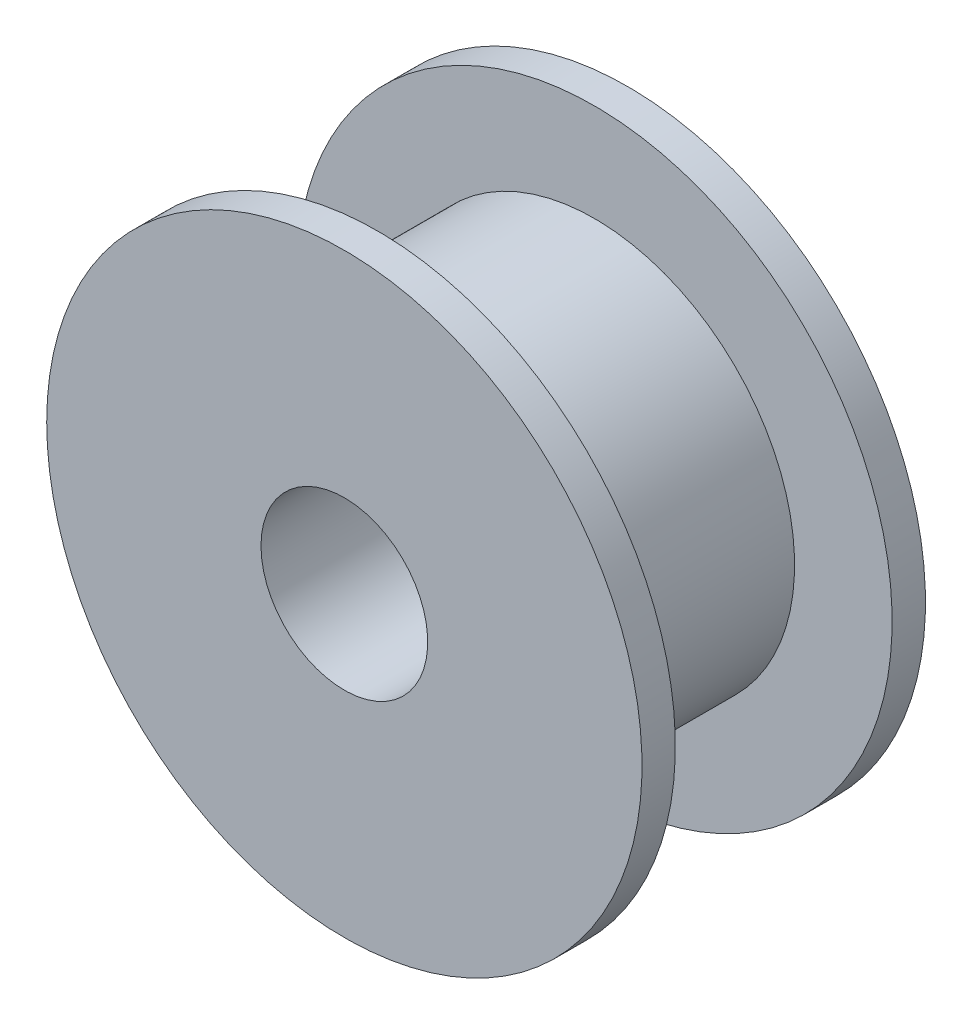
ISO-10303-21;
HEADER;
FILE_DESCRIPTION(('STEP AP214'),'2;1');
FILE_NAME('part.step','',(''),(''),'','','');
FILE_SCHEMA(('AUTOMOTIVE_DESIGN { 1 0 10303 214 1 1 1 1 }'));
ENDSEC;
DATA;
#1=APPLICATION_CONTEXT('core data for automotive mechanical design processes');
#2=APPLICATION_PROTOCOL_DEFINITION('international standard','automotive_design',2000,#1);
#3=PRODUCT_CONTEXT('',#1,'mechanical');
#4=PRODUCT('Part','Part','',(#3));
#5=PRODUCT_RELATED_PRODUCT_CATEGORY('part','',(#4));
#6=PRODUCT_DEFINITION_FORMATION('','',#4);
#7=PRODUCT_DEFINITION_CONTEXT('part definition',#1,'design');
#8=PRODUCT_DEFINITION('design','',#6,#7);
#9=PRODUCT_DEFINITION_SHAPE('','',#8);
#10=(LENGTH_UNIT() NAMED_UNIT(*) SI_UNIT(.MILLI.,.METRE.));
#11=(NAMED_UNIT(*) PLANE_ANGLE_UNIT() SI_UNIT($,.RADIAN.));
#12=(NAMED_UNIT(*) SI_UNIT($,.STERADIAN.) SOLID_ANGLE_UNIT());
#13=UNCERTAINTY_MEASURE_WITH_UNIT(LENGTH_MEASURE(1.E-05),#10,'distance_accuracy_value','');
#14=(GEOMETRIC_REPRESENTATION_CONTEXT(3) GLOBAL_UNCERTAINTY_ASSIGNED_CONTEXT((#13)) GLOBAL_UNIT_ASSIGNED_CONTEXT((#10,
#11,#12)) REPRESENTATION_CONTEXT('',''));
#15=CARTESIAN_POINT('',(0.,0.,0.));
#16=DIRECTION('',(0.,0.,1.));
#17=DIRECTION('',(1.,0.,0.));
#18=AXIS2_PLACEMENT_3D('',#15,#16,#17);
#19=CARTESIAN_POINT('',(0.,0.,3.25));
#20=DIRECTION('',(0.,0.,-1.));
#21=DIRECTION('',(-1.,0.,0.));
#22=AXIS2_PLACEMENT_3D('',#19,#20,#21);
#23=CYLINDRICAL_SURFACE('',#22,6.);
#24=CARTESIAN_POINT('',(0.,0.,0.));
#25=DIRECTION('',(0.,0.,1.));
#26=DIRECTION('',(1.,0.,0.));
#27=AXIS2_PLACEMENT_3D('',#24,#25,#26);
#28=CIRCLE('',#27,6.);
#29=CARTESIAN_POINT('',(-6.,0.,0.));
#30=VERTEX_POINT('',#29);
#31=EDGE_CURVE('E10',#30,#30,#28,.T.);
#32=CARTESIAN_POINT('',(0.,0.,6.5));
#33=DIRECTION('',(0.,0.,1.));
#34=DIRECTION('',(1.,0.,0.));
#35=AXIS2_PLACEMENT_3D('',#32,#33,#34);
#36=CIRCLE('',#35,6.);
#37=CARTESIAN_POINT('',(-6.,0.,6.5));
#38=VERTEX_POINT('',#37);
#39=EDGE_CURVE('E51',#38,#38,#36,.T.);
#40=CARTESIAN_POINT('',(-6.,0.,0.));
#41=CARTESIAN_POINT('',(-6.,0.,0.0677083333333334));
#42=CARTESIAN_POINT('',(-6.,0.,0.135416666666667));
#43=CARTESIAN_POINT('',(-6.,0.,0.270833333333333));
#44=CARTESIAN_POINT('',(-6.,0.,0.338541666666667));
#45=CARTESIAN_POINT('',(-6.,0.,0.473958333333333));
#46=CARTESIAN_POINT('',(-6.,0.,0.541666666666667));
#47=CARTESIAN_POINT('',(-6.,0.,0.677083333333333));
#48=CARTESIAN_POINT('',(-6.,0.,0.744791666666667));
#49=CARTESIAN_POINT('',(-6.,0.,0.880208333333333));
#50=CARTESIAN_POINT('',(-6.,0.,0.947916666666667));
#51=CARTESIAN_POINT('',(-6.,0.,1.08333333333333));
#52=CARTESIAN_POINT('',(-6.,0.,1.15104166666667));
#53=CARTESIAN_POINT('',(-6.,0.,1.28645833333333));
#54=CARTESIAN_POINT('',(-6.,0.,1.35416666666667));
#55=CARTESIAN_POINT('',(-6.,0.,1.48958333333333));
#56=CARTESIAN_POINT('',(-6.,0.,1.55729166666667));
#57=CARTESIAN_POINT('',(-6.,0.,1.69270833333333));
#58=CARTESIAN_POINT('',(-6.,0.,1.76041666666667));
#59=CARTESIAN_POINT('',(-6.,0.,1.89583333333333));
#60=CARTESIAN_POINT('',(-6.,0.,1.96354166666667));
#61=CARTESIAN_POINT('',(-6.,0.,2.09895833333333));
#62=CARTESIAN_POINT('',(-6.,0.,2.16666666666667));
#63=CARTESIAN_POINT('',(-6.,0.,2.30208333333333));
#64=CARTESIAN_POINT('',(-6.,0.,2.36979166666667));
#65=CARTESIAN_POINT('',(-6.,0.,2.50520833333333));
#66=CARTESIAN_POINT('',(-6.,0.,2.57291666666667));
#67=CARTESIAN_POINT('',(-6.,0.,2.70833333333333));
#68=CARTESIAN_POINT('',(-6.,0.,2.77604166666667));
#69=CARTESIAN_POINT('',(-6.,0.,2.91145833333333));
#70=CARTESIAN_POINT('',(-6.,0.,2.97916666666667));
#71=CARTESIAN_POINT('',(-6.,0.,3.11458333333333));
#72=CARTESIAN_POINT('',(-6.,0.,3.18229166666667));
#73=CARTESIAN_POINT('',(-6.,0.,3.31770833333333));
#74=CARTESIAN_POINT('',(-6.,0.,3.38541666666667));
#75=CARTESIAN_POINT('',(-6.,0.,3.52083333333333));
#76=CARTESIAN_POINT('',(-6.,0.,3.58854166666667));
#77=CARTESIAN_POINT('',(-6.,0.,3.72395833333333));
#78=CARTESIAN_POINT('',(-6.,0.,3.79166666666667));
#79=CARTESIAN_POINT('',(-6.,0.,3.92708333333333));
#80=CARTESIAN_POINT('',(-6.,0.,3.99479166666667));
#81=CARTESIAN_POINT('',(-6.,0.,4.13020833333333));
#82=CARTESIAN_POINT('',(-6.,0.,4.19791666666667));
#83=CARTESIAN_POINT('',(-6.,0.,4.33333333333333));
#84=CARTESIAN_POINT('',(-6.,0.,4.40104166666667));
#85=CARTESIAN_POINT('',(-6.,0.,4.53645833333333));
#86=CARTESIAN_POINT('',(-6.,0.,4.60416666666667));
#87=CARTESIAN_POINT('',(-6.,0.,4.73958333333333));
#88=CARTESIAN_POINT('',(-6.,0.,4.80729166666667));
#89=CARTESIAN_POINT('',(-6.,0.,4.94270833333333));
#90=CARTESIAN_POINT('',(-6.,0.,5.01041666666667));
#91=CARTESIAN_POINT('',(-6.,0.,5.14583333333333));
#92=CARTESIAN_POINT('',(-6.,0.,5.21354166666667));
#93=CARTESIAN_POINT('',(-6.,0.,5.34895833333333));
#94=CARTESIAN_POINT('',(-6.,0.,5.41666666666667));
#95=CARTESIAN_POINT('',(-6.,0.,5.55208333333333));
#96=CARTESIAN_POINT('',(-6.,0.,5.61979166666667));
#97=CARTESIAN_POINT('',(-6.,0.,5.75520833333333));
#98=CARTESIAN_POINT('',(-6.,0.,5.82291666666667));
#99=CARTESIAN_POINT('',(-6.,0.,5.95833333333333));
#100=CARTESIAN_POINT('',(-6.,0.,6.02604166666667));
#101=CARTESIAN_POINT('',(-6.,0.,6.16145833333333));
#102=CARTESIAN_POINT('',(-6.,0.,6.22916666666667));
#103=CARTESIAN_POINT('',(-6.,0.,6.36458333333333));
#104=CARTESIAN_POINT('',(-6.,0.,6.43229166666667));
#105=CARTESIAN_POINT('',(-6.,0.,6.5));
#106=B_SPLINE_CURVE_WITH_KNOTS('',3,(#40,#41,#42,#43,#44,#45,#46,#47,#48,#49,#50,#51,#52,#53,
#54,#55,#56,#57,#58,#59,#60,#61,#62,#63,#64,#65,#66,#67,#68,#69,#70,#71,#72,#73,#74,#75,#76,#77,
#78,#79,#80,#81,#82,#83,#84,#85,#86,#87,#88,#89,#90,#91,#92,#93,#94,#95,#96,#97,#98,#99,#100,
#101,#102,#103,#104,#105),.UNSPECIFIED.,.F.,.F.,(4,2,2,2,2,2,2,2,2,2,2,2,2,2,2,2,2,2,2,2,2,2,2,
2,2,2,2,2,2,2,2,2,4),(0.,0.203125,0.40625,0.609375,0.8125,1.015625,1.21875,1.421875,1.625,
1.828125,2.03125,2.234375,2.4375,2.640625,2.84375,3.046875,3.25,3.453125,3.65625,3.859375,
4.0625,4.265625,4.46875,4.671875,4.875,5.078125,5.28125,5.484375,5.6875,5.890625,6.09375,
6.296875,6.5),.UNSPECIFIED.);
#107=EDGE_CURVE('BSEAM32',#30,#38,#106,.T.);
#108=ORIENTED_EDGE('',*,*,#31,.T.);
#109=ORIENTED_EDGE('',*,*,#39,.F.);
#110=ORIENTED_EDGE('',*,*,#107,.T.);
#111=ORIENTED_EDGE('',*,*,#107,.F.);
#112=EDGE_LOOP('',(#108,#110,#109,#111));
#113=FACE_BOUND('',#112,.T.);
#114=ADVANCED_FACE('F32',(#113),#23,.T.);
#115=CARTESIAN_POINT('',(0.,0.,-1.));
#116=DIRECTION('',(0.,0.,1.));
#117=DIRECTION('',(1.,0.,0.));
#118=AXIS2_PLACEMENT_3D('',#115,#116,#117);
#119=CYLINDRICAL_SURFACE('',#118,8.925);
#120=CARTESIAN_POINT('',(0.,0.,-1.));
#121=DIRECTION('',(0.,0.,-1.));
#122=DIRECTION('',(-1.,0.,0.));
#123=AXIS2_PLACEMENT_3D('',#120,#121,#122);
#124=CIRCLE('',#123,8.925);
#125=CARTESIAN_POINT('',(-8.925,0.,-1.));
#126=VERTEX_POINT('',#125);
#127=EDGE_CURVE('E38',#126,#126,#124,.T.);
#128=ORIENTED_EDGE('',*,*,#127,.F.);
#129=EDGE_LOOP('',(#128));
#130=FACE_BOUND('',#129,.T.);
#131=CARTESIAN_POINT('',(0.,0.,0.));
#132=DIRECTION('',(0.,0.,-1.));
#133=DIRECTION('',(-1.,0.,0.));
#134=AXIS2_PLACEMENT_3D('',#131,#132,#133);
#135=CIRCLE('',#134,8.925);
#136=CARTESIAN_POINT('',(-8.925,0.,0.));
#137=VERTEX_POINT('',#136);
#138=EDGE_CURVE('E42',#137,#137,#135,.T.);
#139=ORIENTED_EDGE('',*,*,#138,.T.);
#140=EDGE_LOOP('',(#139));
#141=FACE_BOUND('',#140,.T.);
#142=ADVANCED_FACE('F84',(#130,#141),#119,.T.);
#143=CARTESIAN_POINT('',(0.,0.,-1.));
#144=DIRECTION('',(0.,0.,-1.));
#145=DIRECTION('',(-1.,0.,0.));
#146=AXIS2_PLACEMENT_3D('',#143,#144,#145);
#147=PLANE('',#146);
#148=CARTESIAN_POINT('',(0.,0.,-1.));
#149=DIRECTION('',(0.,0.,-1.));
#150=DIRECTION('',(-1.,0.,0.));
#151=AXIS2_PLACEMENT_3D('',#148,#149,#150);
#152=CIRCLE('',#151,2.5);
#153=CARTESIAN_POINT('',(-2.5,0.,-1.));
#154=VERTEX_POINT('',#153);
#155=EDGE_CURVE('E47',#154,#154,#152,.T.);
#156=ORIENTED_EDGE('',*,*,#155,.F.);
#157=EDGE_LOOP('',(#156));
#158=FACE_BOUND('',#157,.T.);
#159=ORIENTED_EDGE('',*,*,#127,.T.);
#160=EDGE_LOOP('',(#159));
#161=FACE_BOUND('',#160,.T.);
#162=ADVANCED_FACE('F79',(#158,#161),#147,.T.);
#163=CARTESIAN_POINT('',(0.,0.,0.));
#164=DIRECTION('',(0.,0.,-1.));
#165=DIRECTION('',(-1.,0.,0.));
#166=AXIS2_PLACEMENT_3D('',#163,#164,#165);
#167=PLANE('',#166);
#168=ORIENTED_EDGE('',*,*,#31,.F.);
#169=EDGE_LOOP('',(#168));
#170=FACE_BOUND('',#169,.T.);
#171=ORIENTED_EDGE('',*,*,#138,.F.);
#172=EDGE_LOOP('',(#171));
#173=FACE_BOUND('',#172,.T.);
#174=ADVANCED_FACE('F70',(#170,#173),#167,.F.);
#175=CARTESIAN_POINT('',(0.,0.,3.25));
#176=DIRECTION('',(0.,0.,-1.));
#177=DIRECTION('',(-1.,0.,0.));
#178=AXIS2_PLACEMENT_3D('',#175,#176,#177);
#179=CYLINDRICAL_SURFACE('',#178,2.5);
#180=ORIENTED_EDGE('',*,*,#155,.T.);
#181=EDGE_LOOP('',(#180));
#182=FACE_BOUND('',#181,.T.);
#183=CARTESIAN_POINT('',(0.,0.,7.5));
#184=DIRECTION('',(0.,0.,-1.));
#185=DIRECTION('',(-1.,0.,0.));
#186=AXIS2_PLACEMENT_3D('',#183,#184,#185);
#187=CIRCLE('',#186,2.5);
#188=CARTESIAN_POINT('',(-2.5,0.,7.5));
#189=VERTEX_POINT('',#188);
#190=EDGE_CURVE('E58',#189,#189,#187,.T.);
#191=ORIENTED_EDGE('',*,*,#190,.F.);
#192=EDGE_LOOP('',(#191));
#193=FACE_BOUND('',#192,.T.);
#194=ADVANCED_FACE('F67',(#182,#193),#179,.F.);
#195=CARTESIAN_POINT('',(0.,0.,7.5));
#196=DIRECTION('',(0.,0.,-1.));
#197=DIRECTION('',(-1.,0.,0.));
#198=AXIS2_PLACEMENT_3D('',#195,#196,#197);
#199=CYLINDRICAL_SURFACE('',#198,8.925);
#200=CARTESIAN_POINT('',(0.,0.,7.5));
#201=DIRECTION('',(0.,0.,-1.));
#202=DIRECTION('',(-1.,0.,0.));
#203=AXIS2_PLACEMENT_3D('',#200,#201,#202);
#204=CIRCLE('',#203,8.925);
#205=CARTESIAN_POINT('',(-8.925,0.,7.5));
#206=VERTEX_POINT('',#205);
#207=EDGE_CURVE('E54',#206,#206,#204,.T.);
#208=ORIENTED_EDGE('',*,*,#207,.T.);
#209=EDGE_LOOP('',(#208));
#210=FACE_BOUND('',#209,.T.);
#211=CARTESIAN_POINT('',(0.,0.,6.5));
#212=DIRECTION('',(0.,0.,-1.));
#213=DIRECTION('',(-1.,0.,0.));
#214=AXIS2_PLACEMENT_3D('',#211,#212,#213);
#215=CIRCLE('',#214,8.925);
#216=CARTESIAN_POINT('',(-8.925,0.,6.5));
#217=VERTEX_POINT('',#216);
#218=EDGE_CURVE('E55',#217,#217,#215,.T.);
#219=ORIENTED_EDGE('',*,*,#218,.F.);
#220=EDGE_LOOP('',(#219));
#221=FACE_BOUND('',#220,.T.);
#222=ADVANCED_FACE('F69',(#210,#221),#199,.T.);
#223=CARTESIAN_POINT('',(0.,0.,7.5));
#224=DIRECTION('',(0.,0.,1.));
#225=DIRECTION('',(-1.,0.,0.));
#226=AXIS2_PLACEMENT_3D('',#223,#224,#225);
#227=PLANE('',#226);
#228=ORIENTED_EDGE('',*,*,#190,.T.);
#229=EDGE_LOOP('',(#228));
#230=FACE_BOUND('',#229,.T.);
#231=ORIENTED_EDGE('',*,*,#207,.F.);
#232=EDGE_LOOP('',(#231));
#233=FACE_BOUND('',#232,.T.);
#234=ADVANCED_FACE('F64',(#230,#233),#227,.T.);
#235=CARTESIAN_POINT('',(0.,0.,6.5));
#236=DIRECTION('',(0.,0.,1.));
#237=DIRECTION('',(-1.,0.,0.));
#238=AXIS2_PLACEMENT_3D('',#235,#236,#237);
#239=PLANE('',#238);
#240=ORIENTED_EDGE('',*,*,#39,.T.);
#241=EDGE_LOOP('',(#240));
#242=FACE_BOUND('',#241,.T.);
#243=ORIENTED_EDGE('',*,*,#218,.T.);
#244=EDGE_LOOP('',(#243));
#245=FACE_BOUND('',#244,.T.);
#246=ADVANCED_FACE('F92',(#242,#245),#239,.F.);
#247=CLOSED_SHELL('',(#114,#142,#162,#174,#194,#222,#234,#246));
#248=MANIFOLD_SOLID_BREP('B2',#247);
#249=ADVANCED_BREP_SHAPE_REPRESENTATION('',(#18,#248),#14);
#250=SHAPE_DEFINITION_REPRESENTATION(#9,#249);
ENDSEC;
END-ISO-10303-21;
